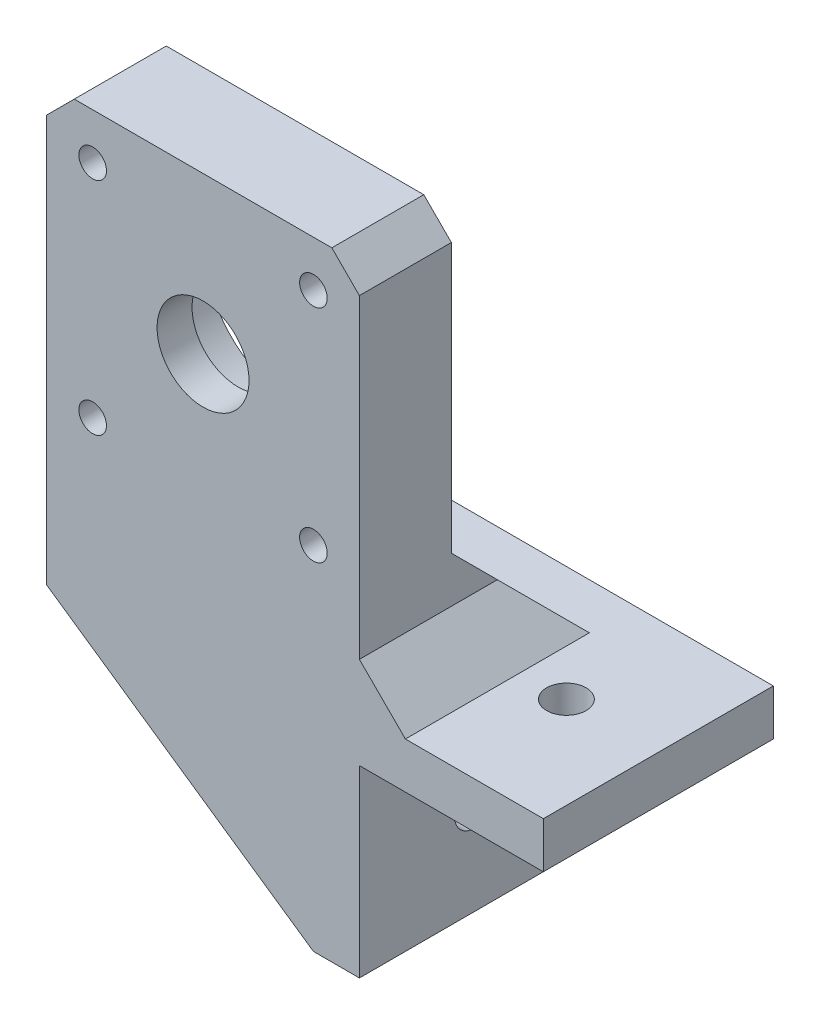
ISO-10303-21;
HEADER;
FILE_DESCRIPTION(('STEP AP214'),'2;1');
FILE_NAME('part.step','',(''),(''),'','','');
FILE_SCHEMA(('AUTOMOTIVE_DESIGN { 1 0 10303 214 1 1 1 1 }'));
ENDSEC;
DATA;
#1=APPLICATION_CONTEXT('core data for automotive mechanical design processes');
#2=APPLICATION_PROTOCOL_DEFINITION('international standard','automotive_design',2000,#1);
#3=PRODUCT_CONTEXT('',#1,'mechanical');
#4=PRODUCT('Part','Part','',(#3));
#5=PRODUCT_RELATED_PRODUCT_CATEGORY('part','',(#4));
#6=PRODUCT_DEFINITION_FORMATION('','',#4);
#7=PRODUCT_DEFINITION_CONTEXT('part definition',#1,'design');
#8=PRODUCT_DEFINITION('design','',#6,#7);
#9=PRODUCT_DEFINITION_SHAPE('','',#8);
#10=(LENGTH_UNIT() NAMED_UNIT(*) SI_UNIT(.MILLI.,.METRE.));
#11=(NAMED_UNIT(*) PLANE_ANGLE_UNIT() SI_UNIT($,.RADIAN.));
#12=(NAMED_UNIT(*) SI_UNIT($,.STERADIAN.) SOLID_ANGLE_UNIT());
#13=UNCERTAINTY_MEASURE_WITH_UNIT(LENGTH_MEASURE(1.E-05),#10,'distance_accuracy_value','');
#14=(GEOMETRIC_REPRESENTATION_CONTEXT(3) GLOBAL_UNCERTAINTY_ASSIGNED_CONTEXT((#13)) GLOBAL_UNIT_ASSIGNED_CONTEXT((#10,
#11,#12)) REPRESENTATION_CONTEXT('',''));
#15=CARTESIAN_POINT('',(0.,0.,0.));
#16=DIRECTION('',(0.,0.,1.));
#17=DIRECTION('',(1.,0.,0.));
#18=AXIS2_PLACEMENT_3D('',#15,#16,#17);
#19=CARTESIAN_POINT('',(-34.0000000000053,20.,25.));
#20=DIRECTION('',(0.,1.,0.));
#21=DIRECTION('',(-1.,0.,0.));
#22=AXIS2_PLACEMENT_3D('',#19,#20,#21);
#23=PLANE('',#22);
#24=DIRECTION('',(-1.,0.,0.));
#25=VECTOR('',#24,1.);
#26=CARTESIAN_POINT('',(-34.0000000000053,20.,20.));
#27=LINE('',#26,#25);
#28=CARTESIAN_POINT('',(-9.99999999999999,20.,20.));
#29=VERTEX_POINT('',#28);
#30=CARTESIAN_POINT('',(-34.0000000000053,20.,20.));
#31=VERTEX_POINT('',#30);
#32=EDGE_CURVE('E423',#29,#31,#27,.T.);
#33=ORIENTED_EDGE('',*,*,#32,.T.);
#34=DIRECTION('',(0.,0.,-1.));
#35=VECTOR('',#34,1.);
#36=CARTESIAN_POINT('',(-34.0000000000053,20.,25.));
#37=LINE('',#36,#35);
#38=CARTESIAN_POINT('',(-34.0000000000053,20.,0.));
#39=VERTEX_POINT('',#38);
#40=EDGE_CURVE('E201',#31,#39,#37,.T.);
#41=ORIENTED_EDGE('',*,*,#40,.T.);
#42=DIRECTION('',(1.,0.,0.));
#43=VECTOR('',#42,1.);
#44=CARTESIAN_POINT('',(-34.0000000000053,20.,0.));
#45=LINE('',#44,#43);
#46=CARTESIAN_POINT('',(-9.99999999999999,20.,0.));
#47=VERTEX_POINT('',#46);
#48=EDGE_CURVE('E409',#39,#47,#45,.T.);
#49=ORIENTED_EDGE('',*,*,#48,.T.);
#50=DIRECTION('',(0.,0.,1.));
#51=VECTOR('',#50,1.);
#52=CARTESIAN_POINT('',(-9.99999999999998,20.,25.));
#53=LINE('',#52,#51);
#54=EDGE_CURVE('E244',#47,#29,#53,.T.);
#55=ORIENTED_EDGE('',*,*,#54,.T.);
#56=EDGE_LOOP('',(#33,#41,#49,#55));
#57=FACE_BOUND('',#56,.T.);
#58=ADVANCED_FACE('F41',(#57),#23,.F.);
#59=CARTESIAN_POINT('',(-5.,20.,25.));
#60=DIRECTION('',(1.,0.,0.));
#61=DIRECTION('',(0.,1.,0.));
#62=AXIS2_PLACEMENT_3D('',#59,#60,#61);
#63=PLANE('',#62);
#64=CARTESIAN_POINT('',(-5.,10.,12.5));
#65=DIRECTION('',(1.,0.,0.));
#66=DIRECTION('',(0.,1.,0.));
#67=AXIS2_PLACEMENT_3D('',#64,#65,#66);
#68=CIRCLE('',#67,2.15);
#69=CARTESIAN_POINT('',(-5.,12.15,12.5));
#70=VERTEX_POINT('',#69);
#71=EDGE_CURVE('E225',#70,#70,#68,.T.);
#72=ORIENTED_EDGE('',*,*,#71,.T.);
#73=EDGE_LOOP('',(#72));
#74=FACE_BOUND('',#73,.T.);
#75=DIRECTION('',(0.,1.,0.));
#76=VECTOR('',#75,1.);
#77=CARTESIAN_POINT('',(-5.,15.,20.));
#78=LINE('',#77,#76);
#79=CARTESIAN_POINT('',(-5.,0.,20.));
#80=VERTEX_POINT('',#79);
#81=CARTESIAN_POINT('',(-5.,15.,20.));
#82=VERTEX_POINT('',#81);
#83=EDGE_CURVE('E162',#80,#82,#78,.T.);
#84=ORIENTED_EDGE('',*,*,#83,.T.);
#85=DIRECTION('',(0.,0.,-1.));
#86=VECTOR('',#85,1.);
#87=CARTESIAN_POINT('',(-5.,15.,0.));
#88=LINE('',#87,#86);
#89=CARTESIAN_POINT('',(-5.,15.,0.));
#90=VERTEX_POINT('',#89);
#91=EDGE_CURVE('E224',#82,#90,#88,.T.);
#92=ORIENTED_EDGE('',*,*,#91,.T.);
#93=DIRECTION('',(0.,-1.,0.));
#94=VECTOR('',#93,1.);
#95=CARTESIAN_POINT('',(-5.,20.,0.));
#96=LINE('',#95,#94);
#97=CARTESIAN_POINT('',(-5.,0.,0.));
#98=VERTEX_POINT('',#97);
#99=EDGE_CURVE('E188',#90,#98,#96,.T.);
#100=ORIENTED_EDGE('',*,*,#99,.T.);
#101=DIRECTION('',(0.,0.,-1.));
#102=VECTOR('',#101,1.);
#103=CARTESIAN_POINT('',(-5.,0.,25.));
#104=LINE('',#103,#102);
#105=EDGE_CURVE('E185',#80,#98,#104,.T.);
#106=ORIENTED_EDGE('',*,*,#105,.F.);
#107=EDGE_LOOP('',(#84,#92,#100,#106));
#108=FACE_BOUND('',#107,.T.);
#109=ADVANCED_FACE('F186',(#74,#108),#63,.F.);
#110=CARTESIAN_POINT('',(-5.,15.,25.));
#111=DIRECTION('',(-0.707106781186551,-0.707106781186544,0.));
#112=DIRECTION('',(0.,0.,1.));
#113=AXIS2_PLACEMENT_3D('',#110,#111,#112);
#114=PLANE('',#113);
#115=DIRECTION('',(-0.707106781186545,0.70710678118655,0.));
#116=VECTOR('',#115,1.);
#117=CARTESIAN_POINT('',(-9.99999999999999,20.,20.));
#118=LINE('',#117,#116);
#119=EDGE_CURVE('E168',#82,#29,#118,.T.);
#120=ORIENTED_EDGE('',*,*,#119,.T.);
#121=ORIENTED_EDGE('',*,*,#54,.F.);
#122=DIRECTION('',(0.707106781186544,-0.707106781186551,0.));
#123=VECTOR('',#122,1.);
#124=CARTESIAN_POINT('',(4.99999999999996,4.99999999999991,0.));
#125=LINE('',#124,#123);
#126=EDGE_CURVE('E252',#90,#47,#125,.F.);
#127=ORIENTED_EDGE('',*,*,#126,.F.);
#128=ORIENTED_EDGE('',*,*,#91,.F.);
#129=EDGE_LOOP('',(#120,#121,#127,#128));
#130=FACE_BOUND('',#129,.T.);
#131=ADVANCED_FACE('F421',(#130),#114,.T.);
#132=CARTESIAN_POINT('',(-17.0000000000053,50.25,25.));
#133=DIRECTION('',(0.,0.,-1.));
#134=DIRECTION('',(-1.,0.,0.));
#135=AXIS2_PLACEMENT_3D('',#132,#133,#134);
#136=CYLINDRICAL_SURFACE('',#135,5.);
#137=CARTESIAN_POINT('',(-17.0000000000053,50.25,25.));
#138=DIRECTION('',(0.,0.,1.));
#139=DIRECTION('',(1.,0.,0.));
#140=AXIS2_PLACEMENT_3D('',#137,#138,#139);
#141=CIRCLE('',#140,5.);
#142=CARTESIAN_POINT('',(-12.0000000000053,50.25,25.));
#143=VERTEX_POINT('',#142);
#144=EDGE_CURVE('E360',#143,#143,#141,.T.);
#145=ORIENTED_EDGE('',*,*,#144,.T.);
#146=EDGE_LOOP('',(#145));
#147=FACE_BOUND('',#146,.T.);
#148=CARTESIAN_POINT('',(-17.0000000000053,50.25,21.2));
#149=DIRECTION('',(0.,0.,-1.));
#150=DIRECTION('',(-1.,0.,0.));
#151=AXIS2_PLACEMENT_3D('',#148,#149,#150);
#152=CIRCLE('',#151,5.);
#153=CARTESIAN_POINT('',(-22.0000000000053,50.25,21.2));
#154=VERTEX_POINT('',#153);
#155=EDGE_CURVE('E285',#154,#154,#152,.T.);
#156=ORIENTED_EDGE('',*,*,#155,.T.);
#157=EDGE_LOOP('',(#156));
#158=FACE_BOUND('',#157,.T.);
#159=ADVANCED_FACE('F490',(#147,#158),#136,.F.);
#160=CARTESIAN_POINT('',(-5.27702881392145E-12,25.,25.));
#161=DIRECTION('',(-1.,0.,0.));
#162=DIRECTION('',(0.,-1.,0.));
#163=AXIS2_PLACEMENT_3D('',#160,#161,#162);
#164=PLANE('',#163);
#165=DIRECTION('',(0.,-1.,0.));
#166=VECTOR('',#165,1.);
#167=CARTESIAN_POINT('',(-5.27588648512213E-12,67.25,15.));
#168=LINE('',#167,#166);
#169=CARTESIAN_POINT('',(-5.27626343105073E-12,64.25,15.));
#170=VERTEX_POINT('',#169);
#171=CARTESIAN_POINT('',(-5.27993865385457E-12,35.0000000000001,15.));
#172=VERTEX_POINT('',#171);
#173=EDGE_CURVE('E289',#170,#172,#168,.T.);
#174=ORIENTED_EDGE('',*,*,#173,.F.);
#175=DIRECTION('',(0.,0.,1.));
#176=VECTOR('',#175,1.);
#177=CARTESIAN_POINT('',(-5.27596759722623E-12,64.25,25.));
#178=LINE('',#177,#176);
#179=CARTESIAN_POINT('',(-5.27596759722623E-12,64.25,25.));
#180=VERTEX_POINT('',#179);
#181=EDGE_CURVE('E281',#170,#180,#178,.T.);
#182=ORIENTED_EDGE('',*,*,#181,.T.);
#183=DIRECTION('',(0.,1.,0.));
#184=VECTOR('',#183,1.);
#185=CARTESIAN_POINT('',(-5.27702881392145E-12,25.,25.));
#186=LINE('',#185,#184);
#187=CARTESIAN_POINT('',(-5.27689362708129E-12,30.,25.));
#188=VERTEX_POINT('',#187);
#189=EDGE_CURVE('E380',#188,#180,#186,.T.);
#190=ORIENTED_EDGE('',*,*,#189,.F.);
#191=DIRECTION('',(0.,0.,-1.));
#192=VECTOR('',#191,1.);
#193=CARTESIAN_POINT('',(-5.27689362708129E-12,30.,15.));
#194=LINE('',#193,#192);
#195=CARTESIAN_POINT('',(-5.27689362708129E-12,30.,9.99999999999997));
#196=VERTEX_POINT('',#195);
#197=EDGE_CURVE('E57',#188,#196,#194,.T.);
#198=ORIENTED_EDGE('',*,*,#197,.T.);
#199=DIRECTION('',(0.,0.707106781186551,0.707106781186544));
#200=VECTOR('',#199,1.);
#201=CARTESIAN_POINT('',(-5.27675844024114E-12,35.,14.9999999999999));
#202=LINE('',#201,#200);
#203=EDGE_CURVE('E11',#196,#172,#202,.T.);
#204=ORIENTED_EDGE('',*,*,#203,.T.);
#205=EDGE_LOOP('',(#174,#182,#190,#198,#204));
#206=FACE_BOUND('',#205,.T.);
#207=ADVANCED_FACE('F308',(#206),#164,.F.);
#208=CARTESIAN_POINT('',(-5.27588648512213E-12,67.25,25.));
#209=DIRECTION('',(0.,-1.,0.));
#210=DIRECTION('',(0.,0.,-1.));
#211=AXIS2_PLACEMENT_3D('',#208,#209,#210);
#212=PLANE('',#211);
#213=DIRECTION('',(1.,0.,0.));
#214=VECTOR('',#213,1.);
#215=CARTESIAN_POINT('',(-5.27588648512213E-12,67.25,15.));
#216=LINE('',#215,#214);
#217=CARTESIAN_POINT('',(-31.0000000000053,67.25,15.));
#218=VERTEX_POINT('',#217);
#219=CARTESIAN_POINT('',(-3.00000000000528,67.25,15.));
#220=VERTEX_POINT('',#219);
#221=EDGE_CURVE('E318',#218,#220,#216,.T.);
#222=ORIENTED_EDGE('',*,*,#221,.F.);
#223=DIRECTION('',(0.,0.,1.));
#224=VECTOR('',#223,1.);
#225=CARTESIAN_POINT('',(-31.0000000000053,67.25,25.));
#226=LINE('',#225,#224);
#227=CARTESIAN_POINT('',(-31.0000000000053,67.25,25.));
#228=VERTEX_POINT('',#227);
#229=EDGE_CURVE('E272',#218,#228,#226,.T.);
#230=ORIENTED_EDGE('',*,*,#229,.T.);
#231=DIRECTION('',(-1.,0.,0.));
#232=VECTOR('',#231,1.);
#233=CARTESIAN_POINT('',(-5.27588648512213E-12,67.25,25.));
#234=LINE('',#233,#232);
#235=CARTESIAN_POINT('',(-3.00000000000528,67.25,25.));
#236=VERTEX_POINT('',#235);
#237=EDGE_CURVE('E384',#236,#228,#234,.T.);
#238=ORIENTED_EDGE('',*,*,#237,.F.);
#239=DIRECTION('',(0.,0.,-1.));
#240=VECTOR('',#239,1.);
#241=CARTESIAN_POINT('',(-3.00000000000528,67.25,25.));
#242=LINE('',#241,#240);
#243=EDGE_CURVE('E268',#236,#220,#242,.T.);
#244=ORIENTED_EDGE('',*,*,#243,.T.);
#245=EDGE_LOOP('',(#222,#230,#238,#244));
#246=FACE_BOUND('',#245,.T.);
#247=ADVANCED_FACE('F483',(#246),#212,.F.);
#248=CARTESIAN_POINT('',(-29.0000000000053,62.25,25.));
#249=DIRECTION('',(0.,0.,-1.));
#250=DIRECTION('',(-1.,0.,0.));
#251=AXIS2_PLACEMENT_3D('',#248,#249,#250);
#252=CYLINDRICAL_SURFACE('',#251,1.5);
#253=CARTESIAN_POINT('',(-29.0000000000053,62.25,25.));
#254=DIRECTION('',(0.,0.,1.));
#255=DIRECTION('',(1.,0.,0.));
#256=AXIS2_PLACEMENT_3D('',#253,#254,#255);
#257=CIRCLE('',#256,1.5);
#258=CARTESIAN_POINT('',(-27.5000000000053,62.25,25.));
#259=VERTEX_POINT('',#258);
#260=EDGE_CURVE('E356',#259,#259,#257,.T.);
#261=ORIENTED_EDGE('',*,*,#260,.T.);
#262=EDGE_LOOP('',(#261));
#263=FACE_BOUND('',#262,.T.);
#264=CARTESIAN_POINT('',(-29.0000000000053,62.25,15.));
#265=DIRECTION('',(0.,0.,-1.));
#266=DIRECTION('',(-1.,0.,0.));
#267=AXIS2_PLACEMENT_3D('',#264,#265,#266);
#268=CIRCLE('',#267,1.5);
#269=CARTESIAN_POINT('',(-30.5000000000053,62.25,15.));
#270=VERTEX_POINT('',#269);
#271=EDGE_CURVE('E335',#270,#270,#268,.T.);
#272=ORIENTED_EDGE('',*,*,#271,.T.);
#273=EDGE_LOOP('',(#272));
#274=FACE_BOUND('',#273,.T.);
#275=ADVANCED_FACE('F486',(#263,#274),#252,.F.);
#276=CARTESIAN_POINT('',(-5.00000000000528,62.25,25.));
#277=DIRECTION('',(0.,0.,-1.));
#278=DIRECTION('',(-1.,0.,0.));
#279=AXIS2_PLACEMENT_3D('',#276,#277,#278);
#280=CYLINDRICAL_SURFACE('',#279,1.5);
#281=CARTESIAN_POINT('',(-5.00000000000528,62.25,25.));
#282=DIRECTION('',(0.,0.,1.));
#283=DIRECTION('',(1.,0.,0.));
#284=AXIS2_PLACEMENT_3D('',#281,#282,#283);
#285=CIRCLE('',#284,1.5);
#286=CARTESIAN_POINT('',(-3.50000000000528,62.25,25.));
#287=VERTEX_POINT('',#286);
#288=EDGE_CURVE('E352',#287,#287,#285,.T.);
#289=ORIENTED_EDGE('',*,*,#288,.T.);
#290=EDGE_LOOP('',(#289));
#291=FACE_BOUND('',#290,.T.);
#292=CARTESIAN_POINT('',(-5.00000000000528,62.25,15.));
#293=DIRECTION('',(0.,0.,-1.));
#294=DIRECTION('',(-1.,0.,0.));
#295=AXIS2_PLACEMENT_3D('',#292,#293,#294);
#296=CIRCLE('',#295,1.5);
#297=CARTESIAN_POINT('',(-6.50000000000528,62.25,15.));
#298=VERTEX_POINT('',#297);
#299=EDGE_CURVE('E331',#298,#298,#296,.T.);
#300=ORIENTED_EDGE('',*,*,#299,.T.);
#301=EDGE_LOOP('',(#300));
#302=FACE_BOUND('',#301,.T.);
#303=ADVANCED_FACE('F464',(#291,#302),#280,.F.);
#304=CARTESIAN_POINT('',(-29.0000000000053,38.25,25.));
#305=DIRECTION('',(0.,0.,-1.));
#306=DIRECTION('',(-1.,0.,0.));
#307=AXIS2_PLACEMENT_3D('',#304,#305,#306);
#308=CYLINDRICAL_SURFACE('',#307,1.5);
#309=CARTESIAN_POINT('',(-29.0000000000053,38.25,25.));
#310=DIRECTION('',(0.,0.,1.));
#311=DIRECTION('',(1.,0.,0.));
#312=AXIS2_PLACEMENT_3D('',#309,#310,#311);
#313=CIRCLE('',#312,1.5);
#314=CARTESIAN_POINT('',(-27.5000000000053,38.25,25.));
#315=VERTEX_POINT('',#314);
#316=EDGE_CURVE('E348',#315,#315,#313,.T.);
#317=ORIENTED_EDGE('',*,*,#316,.T.);
#318=EDGE_LOOP('',(#317));
#319=FACE_BOUND('',#318,.T.);
#320=CARTESIAN_POINT('',(-29.0000000000053,38.25,15.));
#321=DIRECTION('',(0.,0.,-1.));
#322=DIRECTION('',(-1.,0.,0.));
#323=AXIS2_PLACEMENT_3D('',#320,#321,#322);
#324=CIRCLE('',#323,1.5);
#325=CARTESIAN_POINT('',(-30.5000000000053,38.25,15.));
#326=VERTEX_POINT('',#325);
#327=EDGE_CURVE('E240',#326,#326,#324,.T.);
#328=ORIENTED_EDGE('',*,*,#327,.T.);
#329=EDGE_LOOP('',(#328));
#330=FACE_BOUND('',#329,.T.);
#331=ADVANCED_FACE('F454',(#319,#330),#308,.F.);
#332=CARTESIAN_POINT('',(-5.00000000000528,38.25,25.));
#333=DIRECTION('',(0.,0.,-1.));
#334=DIRECTION('',(-1.,0.,0.));
#335=AXIS2_PLACEMENT_3D('',#332,#333,#334);
#336=CYLINDRICAL_SURFACE('',#335,1.5);
#337=CARTESIAN_POINT('',(-5.00000000000528,38.25,25.));
#338=DIRECTION('',(0.,0.,1.));
#339=DIRECTION('',(1.,0.,0.));
#340=AXIS2_PLACEMENT_3D('',#337,#338,#339);
#341=CIRCLE('',#340,1.5);
#342=CARTESIAN_POINT('',(-3.50000000000528,38.25,25.));
#343=VERTEX_POINT('',#342);
#344=EDGE_CURVE('E229',#343,#343,#341,.T.);
#345=ORIENTED_EDGE('',*,*,#344,.T.);
#346=EDGE_LOOP('',(#345));
#347=FACE_BOUND('',#346,.T.);
#348=CARTESIAN_POINT('',(-5.00000000000528,38.25,15.));
#349=DIRECTION('',(0.,0.,-1.));
#350=DIRECTION('',(-1.,0.,0.));
#351=AXIS2_PLACEMENT_3D('',#348,#349,#350);
#352=CIRCLE('',#351,1.5);
#353=CARTESIAN_POINT('',(-6.50000000000528,38.25,15.));
#354=VERTEX_POINT('',#353);
#355=EDGE_CURVE('E236',#354,#354,#352,.T.);
#356=ORIENTED_EDGE('',*,*,#355,.T.);
#357=EDGE_LOOP('',(#356));
#358=FACE_BOUND('',#357,.T.);
#359=ADVANCED_FACE('F451',(#347,#358),#336,.F.);
#360=CARTESIAN_POINT('',(0.,0.,25.));
#361=DIRECTION('',(0.,0.,1.));
#362=DIRECTION('',(1.,0.,0.));
#363=AXIS2_PLACEMENT_3D('',#360,#361,#362);
#364=PLANE('',#363);
#365=DIRECTION('',(0.823212785915355,-0.56773295580359,0.));
#366=VECTOR('',#365,1.);
#367=CARTESIAN_POINT('',(-5.,0.,25.));
#368=LINE('',#367,#366);
#369=CARTESIAN_POINT('',(-34.0000000000053,20.,25.));
#370=VERTEX_POINT('',#369);
#371=CARTESIAN_POINT('',(-5.,0.,25.));
#372=VERTEX_POINT('',#371);
#373=EDGE_CURVE('E182',#370,#372,#368,.T.);
#374=ORIENTED_EDGE('',*,*,#373,.T.);
#375=DIRECTION('',(1.,0.,0.));
#376=VECTOR('',#375,1.);
#377=CARTESIAN_POINT('',(-5.,0.,25.));
#378=LINE('',#377,#376);
#379=CARTESIAN_POINT('',(0.,0.,25.));
#380=VERTEX_POINT('',#379);
#381=EDGE_CURVE('E199',#372,#380,#378,.T.);
#382=ORIENTED_EDGE('',*,*,#381,.T.);
#383=DIRECTION('',(0.,1.,0.));
#384=VECTOR('',#383,1.);
#385=CARTESIAN_POINT('',(0.,0.,25.));
#386=LINE('',#385,#384);
#387=CARTESIAN_POINT('',(0.,20.,25.));
#388=VERTEX_POINT('',#387);
#389=EDGE_CURVE('E367',#380,#388,#386,.T.);
#390=ORIENTED_EDGE('',*,*,#389,.T.);
#391=DIRECTION('',(1.,0.,0.));
#392=VECTOR('',#391,1.);
#393=CARTESIAN_POINT('',(0.,20.,25.));
#394=LINE('',#393,#392);
#395=CARTESIAN_POINT('',(20.,20.,25.));
#396=VERTEX_POINT('',#395);
#397=EDGE_CURVE('E370',#388,#396,#394,.T.);
#398=ORIENTED_EDGE('',*,*,#397,.T.);
#399=DIRECTION('',(0.,1.,0.));
#400=VECTOR('',#399,1.);
#401=CARTESIAN_POINT('',(20.,20.,25.));
#402=LINE('',#401,#400);
#403=CARTESIAN_POINT('',(20.,25.,25.));
#404=VERTEX_POINT('',#403);
#405=EDGE_CURVE('E373',#396,#404,#402,.T.);
#406=ORIENTED_EDGE('',*,*,#405,.T.);
#407=DIRECTION('',(-1.,0.,0.));
#408=VECTOR('',#407,1.);
#409=CARTESIAN_POINT('',(20.,25.,25.));
#410=LINE('',#409,#408);
#411=CARTESIAN_POINT('',(4.99999999999467,25.,25.));
#412=VERTEX_POINT('',#411);
#413=EDGE_CURVE('E376',#404,#412,#410,.T.);
#414=ORIENTED_EDGE('',*,*,#413,.T.);
#415=DIRECTION('',(0.707106781186543,-0.707106781186552,0.));
#416=VECTOR('',#415,1.);
#417=CARTESIAN_POINT('',(-5.27689362708129E-12,30.,25.));
#418=LINE('',#417,#416);
#419=EDGE_CURVE('E255',#412,#188,#418,.F.);
#420=ORIENTED_EDGE('',*,*,#419,.T.);
#421=ORIENTED_EDGE('',*,*,#189,.T.);
#422=DIRECTION('',(0.707106781186544,-0.707106781186551,0.));
#423=VECTOR('',#422,1.);
#424=CARTESIAN_POINT('',(32.1249999999974,32.124999999997,25.));
#425=LINE('',#424,#423);
#426=EDGE_CURVE('E275',#180,#236,#425,.F.);
#427=ORIENTED_EDGE('',*,*,#426,.T.);
#428=ORIENTED_EDGE('',*,*,#237,.T.);
#429=DIRECTION('',(0.707106781186549,0.707106781186546,0.));
#430=VECTOR('',#429,1.);
#431=CARTESIAN_POINT('',(-49.1250000000026,49.1250000000028,25.));
#432=LINE('',#431,#430);
#433=CARTESIAN_POINT('',(-34.0000000000053,64.25,25.));
#434=VERTEX_POINT('',#433);
#435=EDGE_CURVE('E278',#228,#434,#432,.F.);
#436=ORIENTED_EDGE('',*,*,#435,.T.);
#437=DIRECTION('',(0.,-1.,0.));
#438=VECTOR('',#437,1.);
#439=CARTESIAN_POINT('',(-34.0000000000053,67.25,25.));
#440=LINE('',#439,#438);
#441=EDGE_CURVE('E193',#434,#370,#440,.T.);
#442=ORIENTED_EDGE('',*,*,#441,.T.);
#443=EDGE_LOOP('',(#374,#382,#390,#398,#406,#414,#420,#421,#427,#428,#436,#442));
#444=FACE_BOUND('',#443,.T.);
#445=ORIENTED_EDGE('',*,*,#316,.F.);
#446=EDGE_LOOP('',(#445));
#447=FACE_BOUND('',#446,.T.);
#448=ORIENTED_EDGE('',*,*,#260,.F.);
#449=EDGE_LOOP('',(#448));
#450=FACE_BOUND('',#449,.T.);
#451=ORIENTED_EDGE('',*,*,#144,.F.);
#452=EDGE_LOOP('',(#451));
#453=FACE_BOUND('',#452,.T.);
#454=ORIENTED_EDGE('',*,*,#288,.F.);
#455=EDGE_LOOP('',(#454));
#456=FACE_BOUND('',#455,.T.);
#457=ORIENTED_EDGE('',*,*,#344,.F.);
#458=EDGE_LOOP('',(#457));
#459=FACE_BOUND('',#458,.T.);
#460=ADVANCED_FACE('F453',(#444,#447,#450,#453,#456,#459),#364,.T.);
#461=CARTESIAN_POINT('',(0.,0.,0.));
#462=DIRECTION('',(0.,0.,1.));
#463=DIRECTION('',(1.,0.,0.));
#464=AXIS2_PLACEMENT_3D('',#461,#462,#463);
#465=PLANE('',#464);
#466=DIRECTION('',(0.,-1.,0.));
#467=VECTOR('',#466,1.);
#468=CARTESIAN_POINT('',(-34.0000000000053,67.25,0.));
#469=LINE('',#468,#467);
#470=CARTESIAN_POINT('',(-34.0000000000053,25.,0.));
#471=VERTEX_POINT('',#470);
#472=EDGE_CURVE('E406',#471,#39,#469,.T.);
#473=ORIENTED_EDGE('',*,*,#472,.F.);
#474=DIRECTION('',(-1.,0.,0.));
#475=VECTOR('',#474,1.);
#476=CARTESIAN_POINT('',(20.,25.,0.));
#477=LINE('',#476,#475);
#478=CARTESIAN_POINT('',(20.,25.,0.));
#479=VERTEX_POINT('',#478);
#480=EDGE_CURVE('E402',#479,#471,#477,.T.);
#481=ORIENTED_EDGE('',*,*,#480,.F.);
#482=DIRECTION('',(0.,1.,0.));
#483=VECTOR('',#482,1.);
#484=CARTESIAN_POINT('',(20.,20.,0.));
#485=LINE('',#484,#483);
#486=CARTESIAN_POINT('',(20.,20.,0.));
#487=VERTEX_POINT('',#486);
#488=EDGE_CURVE('E399',#487,#479,#485,.T.);
#489=ORIENTED_EDGE('',*,*,#488,.F.);
#490=DIRECTION('',(1.,0.,0.));
#491=VECTOR('',#490,1.);
#492=CARTESIAN_POINT('',(0.,20.,0.));
#493=LINE('',#492,#491);
#494=CARTESIAN_POINT('',(0.,20.,0.));
#495=VERTEX_POINT('',#494);
#496=EDGE_CURVE('E396',#495,#487,#493,.T.);
#497=ORIENTED_EDGE('',*,*,#496,.F.);
#498=DIRECTION('',(0.,1.,0.));
#499=VECTOR('',#498,1.);
#500=CARTESIAN_POINT('',(0.,0.,0.));
#501=LINE('',#500,#499);
#502=CARTESIAN_POINT('',(0.,0.,0.));
#503=VERTEX_POINT('',#502);
#504=EDGE_CURVE('E393',#503,#495,#501,.T.);
#505=ORIENTED_EDGE('',*,*,#504,.F.);
#506=DIRECTION('',(1.,0.,0.));
#507=VECTOR('',#506,1.);
#508=CARTESIAN_POINT('',(-5.,0.,0.));
#509=LINE('',#508,#507);
#510=EDGE_CURVE('E364',#98,#503,#509,.T.);
#511=ORIENTED_EDGE('',*,*,#510,.F.);
#512=ORIENTED_EDGE('',*,*,#99,.F.);
#513=ORIENTED_EDGE('',*,*,#126,.T.);
#514=ORIENTED_EDGE('',*,*,#48,.F.);
#515=EDGE_LOOP('',(#473,#481,#489,#497,#505,#511,#512,#513,#514));
#516=FACE_BOUND('',#515,.T.);
#517=ADVANCED_FACE('F461',(#516),#465,.F.);
#518=CARTESIAN_POINT('',(-5.,0.,25.));
#519=DIRECTION('',(0.,1.,0.));
#520=DIRECTION('',(0.,0.,1.));
#521=AXIS2_PLACEMENT_3D('',#518,#519,#520);
#522=PLANE('',#521);
#523=ORIENTED_EDGE('',*,*,#510,.T.);
#524=DIRECTION('',(0.,0.,-1.));
#525=VECTOR('',#524,1.);
#526=CARTESIAN_POINT('',(0.,0.,25.));
#527=LINE('',#526,#525);
#528=EDGE_CURVE('E220',#380,#503,#527,.T.);
#529=ORIENTED_EDGE('',*,*,#528,.F.);
#530=ORIENTED_EDGE('',*,*,#381,.F.);
#531=EDGE_CURVE('E177',#372,#80,#104,.T.);
#532=ORIENTED_EDGE('',*,*,#531,.T.);
#533=ORIENTED_EDGE('',*,*,#105,.T.);
#534=EDGE_LOOP('',(#523,#529,#530,#532,#533));
#535=FACE_BOUND('',#534,.T.);
#536=ADVANCED_FACE('F196',(#535),#522,.F.);
#537=CARTESIAN_POINT('',(0.,0.,25.));
#538=DIRECTION('',(-1.,0.,0.));
#539=DIRECTION('',(0.,0.,1.));
#540=AXIS2_PLACEMENT_3D('',#537,#538,#539);
#541=PLANE('',#540);
#542=CARTESIAN_POINT('',(0.,10.,12.5));
#543=DIRECTION('',(1.,0.,0.));
#544=DIRECTION('',(0.,0.,-1.));
#545=AXIS2_PLACEMENT_3D('',#542,#543,#544);
#546=CIRCLE('',#545,2.15);
#547=CARTESIAN_POINT('',(0.,10.,10.35));
#548=VERTEX_POINT('',#547);
#549=EDGE_CURVE('E230',#548,#548,#546,.T.);
#550=ORIENTED_EDGE('',*,*,#549,.F.);
#551=EDGE_LOOP('',(#550));
#552=FACE_BOUND('',#551,.T.);
#553=ORIENTED_EDGE('',*,*,#504,.T.);
#554=DIRECTION('',(0.,0.,-1.));
#555=VECTOR('',#554,1.);
#556=CARTESIAN_POINT('',(0.,20.,25.));
#557=LINE('',#556,#555);
#558=EDGE_CURVE('E216',#388,#495,#557,.T.);
#559=ORIENTED_EDGE('',*,*,#558,.F.);
#560=ORIENTED_EDGE('',*,*,#389,.F.);
#561=ORIENTED_EDGE('',*,*,#528,.T.);
#562=EDGE_LOOP('',(#553,#559,#560,#561));
#563=FACE_BOUND('',#562,.T.);
#564=ADVANCED_FACE('F501',(#552,#563),#541,.F.);
#565=CARTESIAN_POINT('',(0.,20.,25.));
#566=DIRECTION('',(0.,1.,0.));
#567=DIRECTION('',(0.,0.,1.));
#568=AXIS2_PLACEMENT_3D('',#565,#566,#567);
#569=PLANE('',#568);
#570=CARTESIAN_POINT('',(10.,20.,12.5));
#571=DIRECTION('',(0.,-1.,0.));
#572=DIRECTION('',(0.,0.,-1.));
#573=AXIS2_PLACEMENT_3D('',#570,#571,#572);
#574=CIRCLE('',#573,2.15);
#575=CARTESIAN_POINT('',(10.,20.,10.35));
#576=VERTEX_POINT('',#575);
#577=EDGE_CURVE('E235',#576,#576,#574,.T.);
#578=ORIENTED_EDGE('',*,*,#577,.F.);
#579=EDGE_LOOP('',(#578));
#580=FACE_BOUND('',#579,.T.);
#581=ORIENTED_EDGE('',*,*,#496,.T.);
#582=DIRECTION('',(0.,0.,-1.));
#583=VECTOR('',#582,1.);
#584=CARTESIAN_POINT('',(20.,20.,25.));
#585=LINE('',#584,#583);
#586=EDGE_CURVE('E212',#396,#487,#585,.T.);
#587=ORIENTED_EDGE('',*,*,#586,.F.);
#588=ORIENTED_EDGE('',*,*,#397,.F.);
#589=ORIENTED_EDGE('',*,*,#558,.T.);
#590=EDGE_LOOP('',(#581,#587,#588,#589));
#591=FACE_BOUND('',#590,.T.);
#592=ADVANCED_FACE('F497',(#580,#591),#569,.F.);
#593=CARTESIAN_POINT('',(20.,20.,25.));
#594=DIRECTION('',(-1.,0.,0.));
#595=DIRECTION('',(0.,0.,1.));
#596=AXIS2_PLACEMENT_3D('',#593,#594,#595);
#597=PLANE('',#596);
#598=ORIENTED_EDGE('',*,*,#488,.T.);
#599=DIRECTION('',(0.,0.,-1.));
#600=VECTOR('',#599,1.);
#601=CARTESIAN_POINT('',(20.,25.,25.));
#602=LINE('',#601,#600);
#603=EDGE_CURVE('E208',#404,#479,#602,.T.);
#604=ORIENTED_EDGE('',*,*,#603,.F.);
#605=ORIENTED_EDGE('',*,*,#405,.F.);
#606=ORIENTED_EDGE('',*,*,#586,.T.);
#607=EDGE_LOOP('',(#598,#604,#605,#606));
#608=FACE_BOUND('',#607,.T.);
#609=ADVANCED_FACE('F493',(#608),#597,.F.);
#610=CARTESIAN_POINT('',(20.,25.,25.));
#611=DIRECTION('',(0.,-1.,0.));
#612=DIRECTION('',(1.,0.,0.));
#613=AXIS2_PLACEMENT_3D('',#610,#611,#612);
#614=PLANE('',#613);
#615=CARTESIAN_POINT('',(10.,25.,12.5));
#616=DIRECTION('',(0.,-1.,0.));
#617=DIRECTION('',(1.,0.,0.));
#618=AXIS2_PLACEMENT_3D('',#615,#616,#617);
#619=CIRCLE('',#618,2.15);
#620=CARTESIAN_POINT('',(12.15,25.,12.5));
#621=VERTEX_POINT('',#620);
#622=EDGE_CURVE('E231',#621,#621,#619,.T.);
#623=ORIENTED_EDGE('',*,*,#622,.T.);
#624=EDGE_LOOP('',(#623));
#625=FACE_BOUND('',#624,.T.);
#626=DIRECTION('',(0.,0.,-1.));
#627=VECTOR('',#626,1.);
#628=CARTESIAN_POINT('',(-34.0000000000053,25.,15.));
#629=LINE('',#628,#627);
#630=CARTESIAN_POINT('',(-34.0000000000053,25.,5.00000000000002));
#631=VERTEX_POINT('',#630);
#632=EDGE_CURVE('E241',#631,#471,#629,.T.);
#633=ORIENTED_EDGE('',*,*,#632,.F.);
#634=DIRECTION('',(1.,0.,0.));
#635=VECTOR('',#634,1.);
#636=CARTESIAN_POINT('',(20.,25.,5.00000000000002));
#637=LINE('',#636,#635);
#638=CARTESIAN_POINT('',(4.99999999999467,25.,5.00000000000002));
#639=VERTEX_POINT('',#638);
#640=EDGE_CURVE('E294',#631,#639,#637,.T.);
#641=ORIENTED_EDGE('',*,*,#640,.T.);
#642=DIRECTION('',(0.,0.,1.));
#643=VECTOR('',#642,1.);
#644=CARTESIAN_POINT('',(4.99999999999467,25.,25.));
#645=LINE('',#644,#643);
#646=EDGE_CURVE('E64',#639,#412,#645,.T.);
#647=ORIENTED_EDGE('',*,*,#646,.T.);
#648=ORIENTED_EDGE('',*,*,#413,.F.);
#649=ORIENTED_EDGE('',*,*,#603,.T.);
#650=ORIENTED_EDGE('',*,*,#480,.T.);
#651=EDGE_LOOP('',(#633,#641,#647,#648,#649,#650));
#652=FACE_BOUND('',#651,.T.);
#653=ADVANCED_FACE('F481',(#625,#652),#614,.F.);
#654=CARTESIAN_POINT('',(-34.0000000000053,67.25,25.));
#655=DIRECTION('',(1.,0.,0.));
#656=DIRECTION('',(0.,1.,0.));
#657=AXIS2_PLACEMENT_3D('',#654,#655,#656);
#658=PLANE('',#657);
#659=ORIENTED_EDGE('',*,*,#441,.F.);
#660=DIRECTION('',(0.,0.,-1.));
#661=VECTOR('',#660,1.);
#662=CARTESIAN_POINT('',(-34.0000000000053,64.25,25.));
#663=LINE('',#662,#661);
#664=CARTESIAN_POINT('',(-34.0000000000053,64.25,15.));
#665=VERTEX_POINT('',#664);
#666=EDGE_CURVE('E258',#434,#665,#663,.T.);
#667=ORIENTED_EDGE('',*,*,#666,.T.);
#668=DIRECTION('',(0.,1.,0.));
#669=VECTOR('',#668,1.);
#670=CARTESIAN_POINT('',(-34.0000000000053,67.25,15.));
#671=LINE('',#670,#669);
#672=CARTESIAN_POINT('',(-34.0000000000053,35.0000000000001,15.));
#673=VERTEX_POINT('',#672);
#674=EDGE_CURVE('E315',#673,#665,#671,.T.);
#675=ORIENTED_EDGE('',*,*,#674,.F.);
#676=DIRECTION('',(0.,-0.707106781186551,-0.707106781186544));
#677=VECTOR('',#676,1.);
#678=CARTESIAN_POINT('',(-34.0000000000053,56.1250000000002,36.1249999999999));
#679=LINE('',#678,#677);
#680=EDGE_CURVE('E297',#673,#631,#679,.T.);
#681=ORIENTED_EDGE('',*,*,#680,.T.);
#682=ORIENTED_EDGE('',*,*,#632,.T.);
#683=ORIENTED_EDGE('',*,*,#472,.T.);
#684=ORIENTED_EDGE('',*,*,#40,.F.);
#685=EDGE_CURVE('E180',#370,#31,#37,.T.);
#686=ORIENTED_EDGE('',*,*,#685,.F.);
#687=EDGE_LOOP('',(#659,#667,#675,#681,#682,#683,#684,#686));
#688=FACE_BOUND('',#687,.T.);
#689=ADVANCED_FACE('F477',(#688),#658,.F.);
#690=CARTESIAN_POINT('',(-30.,10.,12.5));
#691=DIRECTION('',(1.,0.,0.));
#692=DIRECTION('',(0.,0.,-1.));
#693=AXIS2_PLACEMENT_3D('',#690,#691,#692);
#694=CYLINDRICAL_SURFACE('',#693,2.15);
#695=ORIENTED_EDGE('',*,*,#549,.T.);
#696=EDGE_LOOP('',(#695));
#697=FACE_BOUND('',#696,.T.);
#698=ORIENTED_EDGE('',*,*,#71,.F.);
#699=EDGE_LOOP('',(#698));
#700=FACE_BOUND('',#699,.T.);
#701=ADVANCED_FACE('F480',(#697,#700),#694,.F.);
#702=CARTESIAN_POINT('',(10.,50.,12.5));
#703=DIRECTION('',(0.,-1.,0.));
#704=DIRECTION('',(0.,0.,-1.));
#705=AXIS2_PLACEMENT_3D('',#702,#703,#704);
#706=CYLINDRICAL_SURFACE('',#705,2.15);
#707=ORIENTED_EDGE('',*,*,#577,.T.);
#708=EDGE_LOOP('',(#707));
#709=FACE_BOUND('',#708,.T.);
#710=ORIENTED_EDGE('',*,*,#622,.F.);
#711=EDGE_LOOP('',(#710));
#712=FACE_BOUND('',#711,.T.);
#713=ADVANCED_FACE('F441',(#709,#712),#706,.F.);
#714=CARTESIAN_POINT('',(0.,0.,15.));
#715=DIRECTION('',(0.,0.,-1.));
#716=DIRECTION('',(-1.,0.,0.));
#717=AXIS2_PLACEMENT_3D('',#714,#715,#716);
#718=PLANE('',#717);
#719=CARTESIAN_POINT('',(-17.0000000000053,50.25,15.));
#720=DIRECTION('',(0.,0.,-1.));
#721=DIRECTION('',(-1.,0.,0.));
#722=AXIS2_PLACEMENT_3D('',#719,#720,#721);
#723=CIRCLE('',#722,9.75);
#724=CARTESIAN_POINT('',(-26.7500000000053,50.25,15.));
#725=VERTEX_POINT('',#724);
#726=EDGE_CURVE('E321',#725,#725,#723,.T.);
#727=ORIENTED_EDGE('',*,*,#726,.F.);
#728=EDGE_LOOP('',(#727));
#729=FACE_BOUND('',#728,.T.);
#730=ORIENTED_EDGE('',*,*,#271,.F.);
#731=EDGE_LOOP('',(#730));
#732=FACE_BOUND('',#731,.T.);
#733=ORIENTED_EDGE('',*,*,#299,.F.);
#734=EDGE_LOOP('',(#733));
#735=FACE_BOUND('',#734,.T.);
#736=ORIENTED_EDGE('',*,*,#327,.F.);
#737=EDGE_LOOP('',(#736));
#738=FACE_BOUND('',#737,.T.);
#739=ORIENTED_EDGE('',*,*,#355,.F.);
#740=EDGE_LOOP('',(#739));
#741=FACE_BOUND('',#740,.T.);
#742=ORIENTED_EDGE('',*,*,#173,.T.);
#743=DIRECTION('',(-1.,0.,0.));
#744=VECTOR('',#743,1.);
#745=CARTESIAN_POINT('',(0.,35.0000000000001,15.));
#746=LINE('',#745,#744);
#747=EDGE_CURVE('E284',#172,#673,#746,.T.);
#748=ORIENTED_EDGE('',*,*,#747,.T.);
#749=ORIENTED_EDGE('',*,*,#674,.T.);
#750=DIRECTION('',(-0.707106781186549,-0.707106781186546,0.));
#751=VECTOR('',#750,1.);
#752=CARTESIAN_POINT('',(-49.1250000000026,49.1250000000028,15.));
#753=LINE('',#752,#751);
#754=EDGE_CURVE('E265',#665,#218,#753,.F.);
#755=ORIENTED_EDGE('',*,*,#754,.T.);
#756=ORIENTED_EDGE('',*,*,#221,.T.);
#757=DIRECTION('',(-0.707106781186544,0.707106781186551,0.));
#758=VECTOR('',#757,1.);
#759=CARTESIAN_POINT('',(32.1249999999974,32.124999999997,15.));
#760=LINE('',#759,#758);
#761=EDGE_CURVE('E262',#220,#170,#760,.F.);
#762=ORIENTED_EDGE('',*,*,#761,.T.);
#763=EDGE_LOOP('',(#742,#748,#749,#755,#756,#762));
#764=FACE_BOUND('',#763,.T.);
#765=ADVANCED_FACE('F311',(#729,#732,#735,#738,#741,#764),#718,.T.);
#766=CARTESIAN_POINT('',(-5.27689362708129E-12,30.,25.));
#767=DIRECTION('',(0.707106781186552,0.707106781186543,0.));
#768=DIRECTION('',(0.,0.,1.));
#769=AXIS2_PLACEMENT_3D('',#766,#767,#768);
#770=PLANE('',#769);
#771=ORIENTED_EDGE('',*,*,#419,.F.);
#772=ORIENTED_EDGE('',*,*,#646,.F.);
#773=DIRECTION('',(0.577350269189623,-0.57735026918963,-0.577350269189624));
#774=VECTOR('',#773,1.);
#775=CARTESIAN_POINT('',(-5.00000000000525,35.,15.));
#776=LINE('',#775,#774);
#777=EDGE_CURVE('E51',#639,#196,#776,.F.);
#778=ORIENTED_EDGE('',*,*,#777,.T.);
#779=ORIENTED_EDGE('',*,*,#197,.F.);
#780=EDGE_LOOP('',(#771,#772,#778,#779));
#781=FACE_BOUND('',#780,.T.);
#782=ADVANCED_FACE('F302',(#781),#770,.T.);
#783=CARTESIAN_POINT('',(-34.0000000000053,64.25,25.));
#784=DIRECTION('',(0.707106781186546,-0.707106781186549,0.));
#785=DIRECTION('',(0.,0.,-1.));
#786=AXIS2_PLACEMENT_3D('',#783,#784,#785);
#787=PLANE('',#786);
#788=ORIENTED_EDGE('',*,*,#435,.F.);
#789=ORIENTED_EDGE('',*,*,#229,.F.);
#790=ORIENTED_EDGE('',*,*,#754,.F.);
#791=ORIENTED_EDGE('',*,*,#666,.F.);
#792=EDGE_LOOP('',(#788,#789,#790,#791));
#793=FACE_BOUND('',#792,.T.);
#794=ADVANCED_FACE('F519',(#793),#787,.F.);
#795=CARTESIAN_POINT('',(-3.00000000000528,67.25,25.));
#796=DIRECTION('',(-0.707106781186551,-0.707106781186544,0.));
#797=DIRECTION('',(0.,0.,-1.));
#798=AXIS2_PLACEMENT_3D('',#795,#796,#797);
#799=PLANE('',#798);
#800=ORIENTED_EDGE('',*,*,#426,.F.);
#801=ORIENTED_EDGE('',*,*,#181,.F.);
#802=ORIENTED_EDGE('',*,*,#761,.F.);
#803=ORIENTED_EDGE('',*,*,#243,.F.);
#804=EDGE_LOOP('',(#800,#801,#802,#803));
#805=FACE_BOUND('',#804,.T.);
#806=ADVANCED_FACE('F524',(#805),#799,.F.);
#807=CARTESIAN_POINT('',(-17.0000000000053,50.25,21.2));
#808=DIRECTION('',(0.,0.,-1.));
#809=DIRECTION('',(-1.,0.,0.));
#810=AXIS2_PLACEMENT_3D('',#807,#808,#809);
#811=CYLINDRICAL_SURFACE('',#810,9.75);
#812=CARTESIAN_POINT('',(-17.0000000000053,50.25,21.2));
#813=DIRECTION('',(0.,0.,-1.));
#814=DIRECTION('',(-1.,0.,0.));
#815=AXIS2_PLACEMENT_3D('',#812,#813,#814);
#816=CIRCLE('',#815,9.75);
#817=CARTESIAN_POINT('',(-26.7500000000053,50.25,21.2));
#818=VERTEX_POINT('',#817);
#819=EDGE_CURVE('E290',#818,#818,#816,.T.);
#820=CARTESIAN_POINT('',(-26.7500000000053,50.25,21.2));
#821=CARTESIAN_POINT('',(-26.7500000000053,50.25,21.1354166666667));
#822=CARTESIAN_POINT('',(-26.7500000000053,50.25,21.0708333333333));
#823=CARTESIAN_POINT('',(-26.7500000000053,50.25,20.9416666666667));
#824=CARTESIAN_POINT('',(-26.7500000000053,50.25,20.8770833333333));
#825=CARTESIAN_POINT('',(-26.7500000000053,50.25,20.7479166666667));
#826=CARTESIAN_POINT('',(-26.7500000000053,50.25,20.6833333333333));
#827=CARTESIAN_POINT('',(-26.7500000000053,50.25,20.5541666666667));
#828=CARTESIAN_POINT('',(-26.7500000000053,50.25,20.4895833333333));
#829=CARTESIAN_POINT('',(-26.7500000000053,50.25,20.3604166666667));
#830=CARTESIAN_POINT('',(-26.7500000000053,50.25,20.2958333333333));
#831=CARTESIAN_POINT('',(-26.7500000000053,50.25,20.1666666666667));
#832=CARTESIAN_POINT('',(-26.7500000000053,50.25,20.1020833333333));
#833=CARTESIAN_POINT('',(-26.7500000000053,50.25,19.9729166666667));
#834=CARTESIAN_POINT('',(-26.7500000000053,50.25,19.9083333333333));
#835=CARTESIAN_POINT('',(-26.7500000000053,50.25,19.7791666666667));
#836=CARTESIAN_POINT('',(-26.7500000000053,50.25,19.7145833333333));
#837=CARTESIAN_POINT('',(-26.7500000000053,50.25,19.5854166666667));
#838=CARTESIAN_POINT('',(-26.7500000000053,50.25,19.5208333333333));
#839=CARTESIAN_POINT('',(-26.7500000000053,50.25,19.3916666666667));
#840=CARTESIAN_POINT('',(-26.7500000000053,50.25,19.3270833333333));
#841=CARTESIAN_POINT('',(-26.7500000000053,50.25,19.1979166666667));
#842=CARTESIAN_POINT('',(-26.7500000000053,50.25,19.1333333333333));
#843=CARTESIAN_POINT('',(-26.7500000000053,50.25,19.0041666666667));
#844=CARTESIAN_POINT('',(-26.7500000000053,50.25,18.9395833333333));
#845=CARTESIAN_POINT('',(-26.7500000000053,50.25,18.8104166666667));
#846=CARTESIAN_POINT('',(-26.7500000000053,50.25,18.7458333333333));
#847=CARTESIAN_POINT('',(-26.7500000000053,50.25,18.6166666666667));
#848=CARTESIAN_POINT('',(-26.7500000000053,50.25,18.5520833333333));
#849=CARTESIAN_POINT('',(-26.7500000000053,50.25,18.4229166666667));
#850=CARTESIAN_POINT('',(-26.7500000000053,50.25,18.3583333333333));
#851=CARTESIAN_POINT('',(-26.7500000000053,50.25,18.2291666666667));
#852=CARTESIAN_POINT('',(-26.7500000000053,50.25,18.1645833333333));
#853=CARTESIAN_POINT('',(-26.7500000000053,50.25,18.0354166666667));
#854=CARTESIAN_POINT('',(-26.7500000000053,50.25,17.9708333333333));
#855=CARTESIAN_POINT('',(-26.7500000000053,50.25,17.8416666666667));
#856=CARTESIAN_POINT('',(-26.7500000000053,50.25,17.7770833333333));
#857=CARTESIAN_POINT('',(-26.7500000000053,50.25,17.6479166666667));
#858=CARTESIAN_POINT('',(-26.7500000000053,50.25,17.5833333333333));
#859=CARTESIAN_POINT('',(-26.7500000000053,50.25,17.4541666666667));
#860=CARTESIAN_POINT('',(-26.7500000000053,50.25,17.3895833333333));
#861=CARTESIAN_POINT('',(-26.7500000000053,50.25,17.2604166666667));
#862=CARTESIAN_POINT('',(-26.7500000000053,50.25,17.1958333333333));
#863=CARTESIAN_POINT('',(-26.7500000000053,50.25,17.0666666666667));
#864=CARTESIAN_POINT('',(-26.7500000000053,50.25,17.0020833333333));
#865=CARTESIAN_POINT('',(-26.7500000000053,50.25,16.8729166666667));
#866=CARTESIAN_POINT('',(-26.7500000000053,50.25,16.8083333333333));
#867=CARTESIAN_POINT('',(-26.7500000000053,50.25,16.6791666666667));
#868=CARTESIAN_POINT('',(-26.7500000000053,50.25,16.6145833333333));
#869=CARTESIAN_POINT('',(-26.7500000000053,50.25,16.4854166666667));
#870=CARTESIAN_POINT('',(-26.7500000000053,50.25,16.4208333333333));
#871=CARTESIAN_POINT('',(-26.7500000000053,50.25,16.2916666666667));
#872=CARTESIAN_POINT('',(-26.7500000000053,50.25,16.2270833333333));
#873=CARTESIAN_POINT('',(-26.7500000000053,50.25,16.0979166666667));
#874=CARTESIAN_POINT('',(-26.7500000000053,50.25,16.0333333333333));
#875=CARTESIAN_POINT('',(-26.7500000000053,50.25,15.9041666666667));
#876=CARTESIAN_POINT('',(-26.7500000000053,50.25,15.8395833333333));
#877=CARTESIAN_POINT('',(-26.7500000000053,50.25,15.7104166666667));
#878=CARTESIAN_POINT('',(-26.7500000000053,50.25,15.6458333333333));
#879=CARTESIAN_POINT('',(-26.7500000000053,50.25,15.5166666666667));
#880=CARTESIAN_POINT('',(-26.7500000000053,50.25,15.4520833333333));
#881=CARTESIAN_POINT('',(-26.7500000000053,50.25,15.3229166666667));
#882=CARTESIAN_POINT('',(-26.7500000000053,50.25,15.2583333333333));
#883=CARTESIAN_POINT('',(-26.7500000000053,50.25,15.1291666666667));
#884=CARTESIAN_POINT('',(-26.7500000000053,50.25,15.0645833333333));
#885=CARTESIAN_POINT('',(-26.7500000000053,50.25,15.));
#886=B_SPLINE_CURVE_WITH_KNOTS('',3,(#820,#821,#822,#823,#824,#825,#826,#827,#828,#829,#830,
#831,#832,#833,#834,#835,#836,#837,#838,#839,#840,#841,#842,#843,#844,#845,#846,#847,#848,#849,
#850,#851,#852,#853,#854,#855,#856,#857,#858,#859,#860,#861,#862,#863,#864,#865,#866,#867,#868,
#869,#870,#871,#872,#873,#874,#875,#876,#877,#878,#879,#880,#881,#882,#883,#884,#885),
.UNSPECIFIED.,.F.,.F.,(4,2,2,2,2,2,2,2,2,2,2,2,2,2,2,2,2,2,2,2,2,2,2,2,2,2,2,2,2,2,2,2,4),(0.,
0.193749999999999,0.387499999999999,0.581249999999998,0.774999999999998,0.968749999999997,
1.1625,1.35625,1.55,1.74375,1.9375,2.13125,2.325,2.51875,2.7125,2.90625,3.1,3.29375,3.4875,
3.68125,3.875,4.06875,4.2625,4.45625,4.65,4.84375,5.0375,5.23125,5.425,5.61875,5.8125,6.00625,
6.2),.UNSPECIFIED.);
#887=EDGE_CURVE('BSEAM437',#818,#725,#886,.T.);
#888=ORIENTED_EDGE('',*,*,#819,.F.);
#889=ORIENTED_EDGE('',*,*,#726,.T.);
#890=ORIENTED_EDGE('',*,*,#887,.T.);
#891=ORIENTED_EDGE('',*,*,#887,.F.);
#892=EDGE_LOOP('',(#888,#890,#889,#891));
#893=FACE_BOUND('',#892,.T.);
#894=ADVANCED_FACE('F437',(#893),#811,.F.);
#895=CARTESIAN_POINT('',(-17.0000000000053,50.25,21.2));
#896=DIRECTION('',(0.,0.,-1.));
#897=DIRECTION('',(-1.,0.,0.));
#898=AXIS2_PLACEMENT_3D('',#895,#896,#897);
#899=PLANE('',#898);
#900=ORIENTED_EDGE('',*,*,#155,.F.);
#901=EDGE_LOOP('',(#900));
#902=FACE_BOUND('',#901,.T.);
#903=ORIENTED_EDGE('',*,*,#819,.T.);
#904=EDGE_LOOP('',(#903));
#905=FACE_BOUND('',#904,.T.);
#906=ADVANCED_FACE('F533',(#902,#905),#899,.T.);
#907=CARTESIAN_POINT('',(-5.,0.,20.));
#908=DIRECTION('',(-0.56773295580359,-0.823212785915355,0.));
#909=DIRECTION('',(0.823212785915355,-0.56773295580359,0.));
#910=AXIS2_PLACEMENT_3D('',#907,#908,#909);
#911=PLANE('',#910);
#912=ORIENTED_EDGE('',*,*,#373,.F.);
#913=ORIENTED_EDGE('',*,*,#685,.T.);
#914=DIRECTION('',(0.823212785915355,-0.56773295580359,0.));
#915=VECTOR('',#914,1.);
#916=CARTESIAN_POINT('',(-5.,0.,20.));
#917=LINE('',#916,#915);
#918=EDGE_CURVE('E165',#31,#80,#917,.T.);
#919=ORIENTED_EDGE('',*,*,#918,.T.);
#920=ORIENTED_EDGE('',*,*,#531,.F.);
#921=EDGE_LOOP('',(#912,#913,#919,#920));
#922=FACE_BOUND('',#921,.T.);
#923=ADVANCED_FACE('F175',(#922),#911,.T.);
#924=CARTESIAN_POINT('',(0.,0.,20.));
#925=DIRECTION('',(0.,0.,1.));
#926=DIRECTION('',(1.,0.,0.));
#927=AXIS2_PLACEMENT_3D('',#924,#925,#926);
#928=PLANE('',#927);
#929=ORIENTED_EDGE('',*,*,#918,.F.);
#930=ORIENTED_EDGE('',*,*,#32,.F.);
#931=ORIENTED_EDGE('',*,*,#119,.F.);
#932=ORIENTED_EDGE('',*,*,#83,.F.);
#933=EDGE_LOOP('',(#929,#930,#931,#932));
#934=FACE_BOUND('',#933,.T.);
#935=ADVANCED_FACE('F164',(#934),#928,.F.);
#936=CARTESIAN_POINT('',(0.,35.0000000000001,15.));
#937=DIRECTION('',(0.,-0.707106781186544,0.707106781186551));
#938=DIRECTION('',(-1.,0.,0.));
#939=AXIS2_PLACEMENT_3D('',#936,#937,#938);
#940=PLANE('',#939);
#941=ORIENTED_EDGE('',*,*,#777,.F.);
#942=ORIENTED_EDGE('',*,*,#640,.F.);
#943=ORIENTED_EDGE('',*,*,#680,.F.);
#944=ORIENTED_EDGE('',*,*,#747,.F.);
#945=ORIENTED_EDGE('',*,*,#203,.F.);
#946=EDGE_LOOP('',(#941,#942,#943,#944,#945));
#947=FACE_BOUND('',#946,.T.);
#948=ADVANCED_FACE('F44',(#947),#940,.F.);
#949=CLOSED_SHELL('',(#58,#109,#131,#159,#207,#247,#275,#303,#331,#359,#460,#517,#536,#564,#592,
#609,#653,#689,#701,#713,#765,#782,#794,#806,#894,#906,#923,#935,#948));
#950=MANIFOLD_SOLID_BREP('B2',#949);
#951=ADVANCED_BREP_SHAPE_REPRESENTATION('',(#18,#950),#14);
#952=SHAPE_DEFINITION_REPRESENTATION(#9,#951);
ENDSEC;
END-ISO-10303-21;
